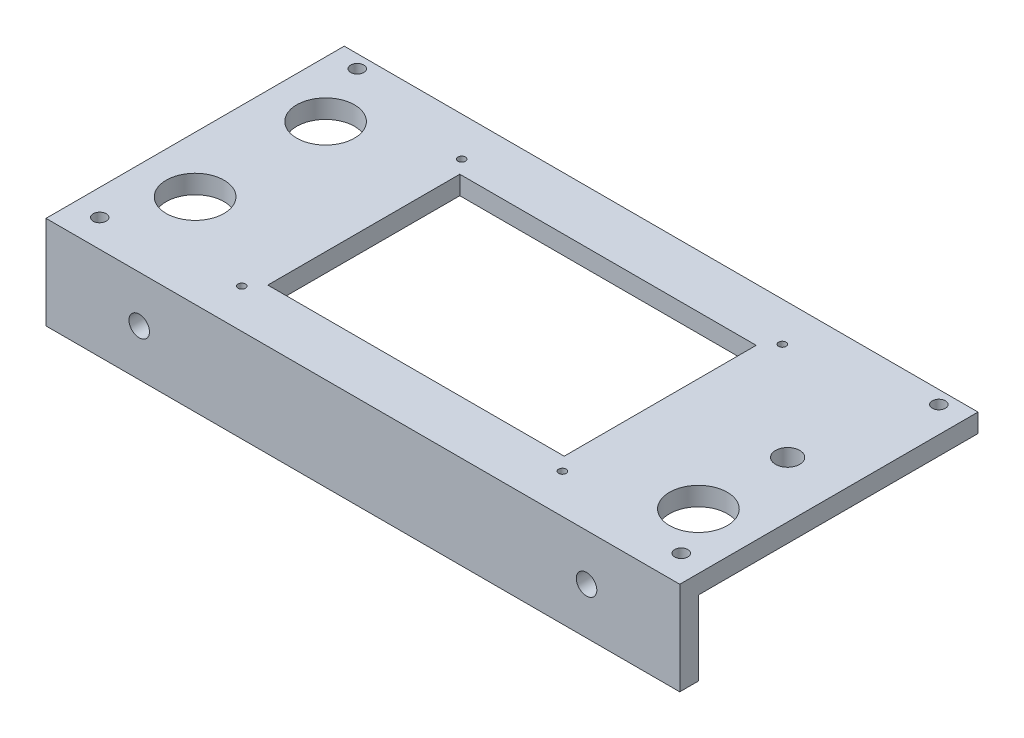
ISO-10303-21;
HEADER;
FILE_DESCRIPTION(('STEP AP214'),'2;1');
FILE_NAME('part.step','',(''),(''),'','','');
FILE_SCHEMA(('AUTOMOTIVE_DESIGN { 1 0 10303 214 1 1 1 1 }'));
ENDSEC;
DATA;
#1=APPLICATION_CONTEXT('core data for automotive mechanical design processes');
#2=APPLICATION_PROTOCOL_DEFINITION('international standard','automotive_design',2000,#1);
#3=PRODUCT_CONTEXT('',#1,'mechanical');
#4=PRODUCT('Part','Part','',(#3));
#5=PRODUCT_RELATED_PRODUCT_CATEGORY('part','',(#4));
#6=PRODUCT_DEFINITION_FORMATION('','',#4);
#7=PRODUCT_DEFINITION_CONTEXT('part definition',#1,'design');
#8=PRODUCT_DEFINITION('design','',#6,#7);
#9=PRODUCT_DEFINITION_SHAPE('','',#8);
#10=(LENGTH_UNIT() NAMED_UNIT(*) SI_UNIT(.MILLI.,.METRE.));
#11=(NAMED_UNIT(*) PLANE_ANGLE_UNIT() SI_UNIT($,.RADIAN.));
#12=(NAMED_UNIT(*) SI_UNIT($,.STERADIAN.) SOLID_ANGLE_UNIT());
#13=UNCERTAINTY_MEASURE_WITH_UNIT(LENGTH_MEASURE(1.E-05),#10,'distance_accuracy_value','');
#14=(GEOMETRIC_REPRESENTATION_CONTEXT(3) GLOBAL_UNCERTAINTY_ASSIGNED_CONTEXT((#13)) GLOBAL_UNIT_ASSIGNED_CONTEXT((#10,
#11,#12)) REPRESENTATION_CONTEXT('',''));
#15=CARTESIAN_POINT('',(0.,0.,0.));
#16=DIRECTION('',(0.,0.,1.));
#17=DIRECTION('',(1.,0.,0.));
#18=AXIS2_PLACEMENT_3D('',#15,#16,#17);
#19=CARTESIAN_POINT('',(-27.8571428571429,5.,-29.4047619047619));
#20=DIRECTION('',(1.,0.,0.));
#21=DIRECTION('',(0.,0.,-1.));
#22=AXIS2_PLACEMENT_3D('',#19,#20,#21);
#23=PLANE('',#22);
#24=DIRECTION('',(0.,0.,1.));
#25=VECTOR('',#24,1.);
#26=CARTESIAN_POINT('',(-27.8571428571429,0.,-29.4047619047619));
#27=LINE('',#26,#25);
#28=CARTESIAN_POINT('',(-27.8571428571429,0.,-29.4047619047619));
#29=VERTEX_POINT('',#28);
#30=CARTESIAN_POINT('',(-27.8571428571429,0.,45.5952380952381));
#31=VERTEX_POINT('',#30);
#32=EDGE_CURVE('E189',#29,#31,#27,.T.);
#33=ORIENTED_EDGE('',*,*,#32,.T.);
#34=DIRECTION('',(0.,1.,0.));
#35=VECTOR('',#34,1.);
#36=CARTESIAN_POINT('',(-27.8571428571429,5.,45.5952380952381));
#37=LINE('',#36,#35);
#38=CARTESIAN_POINT('',(-27.8571428571429,-20.,45.5952380952381));
#39=VERTEX_POINT('',#38);
#40=EDGE_CURVE('E130',#39,#31,#37,.T.);
#41=ORIENTED_EDGE('',*,*,#40,.F.);
#42=DIRECTION('',(0.,0.,1.));
#43=VECTOR('',#42,1.);
#44=CARTESIAN_POINT('',(-27.8571428571429,-20.,45.5952380952381));
#45=LINE('',#44,#43);
#46=CARTESIAN_POINT('',(-27.8571428571429,-20.,50.5952380952381));
#47=VERTEX_POINT('',#46);
#48=EDGE_CURVE('E128',#39,#47,#45,.T.);
#49=ORIENTED_EDGE('',*,*,#48,.T.);
#50=DIRECTION('',(0.,-1.,0.));
#51=VECTOR('',#50,1.);
#52=CARTESIAN_POINT('',(-27.8571428571429,5.,50.5952380952381));
#53=LINE('',#52,#51);
#54=CARTESIAN_POINT('',(-27.8571428571429,5.,50.5952380952381));
#55=VERTEX_POINT('',#54);
#56=EDGE_CURVE('E43',#55,#47,#53,.T.);
#57=ORIENTED_EDGE('',*,*,#56,.F.);
#58=DIRECTION('',(0.,0.,1.));
#59=VECTOR('',#58,1.);
#60=CARTESIAN_POINT('',(-27.8571428571429,5.,-29.4047619047619));
#61=LINE('',#60,#59);
#62=CARTESIAN_POINT('',(-27.8571428571429,5.,-29.4047619047619));
#63=VERTEX_POINT('',#62);
#64=EDGE_CURVE('E195',#63,#55,#61,.T.);
#65=ORIENTED_EDGE('',*,*,#64,.F.);
#66=DIRECTION('',(0.,-1.,0.));
#67=VECTOR('',#66,1.);
#68=CARTESIAN_POINT('',(-27.8571428571429,5.,-29.4047619047619));
#69=LINE('',#68,#67);
#70=EDGE_CURVE('E204',#63,#29,#69,.T.);
#71=ORIENTED_EDGE('',*,*,#70,.T.);
#72=EDGE_LOOP('',(#33,#41,#49,#57,#65,#71));
#73=FACE_BOUND('',#72,.T.);
#74=ADVANCED_FACE('F35',(#73),#23,.F.);
#75=CARTESIAN_POINT('',(-27.8571428571429,5.,50.5952380952381));
#76=DIRECTION('',(0.,0.,-1.));
#77=DIRECTION('',(-1.,0.,0.));
#78=AXIS2_PLACEMENT_3D('',#75,#76,#77);
#79=PLANE('',#78);
#80=CARTESIAN_POINT('',(-2.85714285714288,-7.5,50.5952380952381));
#81=DIRECTION('',(0.,0.,1.));
#82=DIRECTION('',(1.,0.,0.));
#83=AXIS2_PLACEMENT_3D('',#80,#81,#82);
#84=CIRCLE('',#83,2.75);
#85=CARTESIAN_POINT('',(-0.107142857142879,-7.5,50.5952380952381));
#86=VERTEX_POINT('',#85);
#87=EDGE_CURVE('E221',#86,#86,#84,.T.);
#88=ORIENTED_EDGE('',*,*,#87,.F.);
#89=EDGE_LOOP('',(#88));
#90=FACE_BOUND('',#89,.T.);
#91=CARTESIAN_POINT('',(117.142857142857,-7.5,50.5952380952381));
#92=DIRECTION('',(0.,0.,1.));
#93=DIRECTION('',(1.,0.,0.));
#94=AXIS2_PLACEMENT_3D('',#91,#92,#93);
#95=CIRCLE('',#94,2.75000000000001);
#96=CARTESIAN_POINT('',(119.892857142857,-7.5,50.5952380952381));
#97=VERTEX_POINT('',#96);
#98=EDGE_CURVE('E251',#97,#97,#95,.T.);
#99=ORIENTED_EDGE('',*,*,#98,.F.);
#100=EDGE_LOOP('',(#99));
#101=FACE_BOUND('',#100,.T.);
#102=ORIENTED_EDGE('',*,*,#56,.T.);
#103=DIRECTION('',(-1.,0.,0.));
#104=VECTOR('',#103,1.);
#105=CARTESIAN_POINT('',(142.142857142857,-20.,50.5952380952381));
#106=LINE('',#105,#104);
#107=CARTESIAN_POINT('',(142.142857142857,-20.,50.5952380952381));
#108=VERTEX_POINT('',#107);
#109=EDGE_CURVE('E120',#108,#47,#106,.T.);
#110=ORIENTED_EDGE('',*,*,#109,.F.);
#111=DIRECTION('',(0.,-1.,0.));
#112=VECTOR('',#111,1.);
#113=CARTESIAN_POINT('',(142.142857142857,5.,50.5952380952381));
#114=LINE('',#113,#112);
#115=CARTESIAN_POINT('',(142.142857142857,5.,50.5952380952381));
#116=VERTEX_POINT('',#115);
#117=EDGE_CURVE('E136',#116,#108,#114,.T.);
#118=ORIENTED_EDGE('',*,*,#117,.F.);
#119=DIRECTION('',(1.,0.,0.));
#120=VECTOR('',#119,1.);
#121=CARTESIAN_POINT('',(-27.8571428571429,5.,50.5952380952381));
#122=LINE('',#121,#120);
#123=EDGE_CURVE('E197',#55,#116,#122,.T.);
#124=ORIENTED_EDGE('',*,*,#123,.F.);
#125=EDGE_LOOP('',(#102,#110,#118,#124));
#126=FACE_BOUND('',#125,.T.);
#127=ADVANCED_FACE('F276',(#90,#101,#126),#79,.F.);
#128=CARTESIAN_POINT('',(142.142857142857,5.,-29.4047619047619));
#129=DIRECTION('',(-1.,0.,0.));
#130=DIRECTION('',(0.,0.,1.));
#131=AXIS2_PLACEMENT_3D('',#128,#129,#130);
#132=PLANE('',#131);
#133=DIRECTION('',(0.,-1.,0.));
#134=VECTOR('',#133,1.);
#135=CARTESIAN_POINT('',(142.142857142857,5.,-29.4047619047619));
#136=LINE('',#135,#134);
#137=CARTESIAN_POINT('',(142.142857142857,5.,-29.4047619047619));
#138=VERTEX_POINT('',#137);
#139=CARTESIAN_POINT('',(142.142857142857,0.,-29.4047619047619));
#140=VERTEX_POINT('',#139);
#141=EDGE_CURVE('E212',#138,#140,#136,.T.);
#142=ORIENTED_EDGE('',*,*,#141,.F.);
#143=DIRECTION('',(0.,0.,-1.));
#144=VECTOR('',#143,1.);
#145=CARTESIAN_POINT('',(142.142857142857,5.,-29.4047619047619));
#146=LINE('',#145,#144);
#147=EDGE_CURVE('E200',#116,#138,#146,.T.);
#148=ORIENTED_EDGE('',*,*,#147,.F.);
#149=ORIENTED_EDGE('',*,*,#117,.T.);
#150=DIRECTION('',(0.,0.,1.));
#151=VECTOR('',#150,1.);
#152=CARTESIAN_POINT('',(142.142857142857,-20.,45.5952380952381));
#153=LINE('',#152,#151);
#154=CARTESIAN_POINT('',(142.142857142857,-20.,45.5952380952381));
#155=VERTEX_POINT('',#154);
#156=EDGE_CURVE('E126',#155,#108,#153,.T.);
#157=ORIENTED_EDGE('',*,*,#156,.F.);
#158=DIRECTION('',(0.,-1.,0.));
#159=VECTOR('',#158,1.);
#160=CARTESIAN_POINT('',(142.142857142857,5.,45.5952380952381));
#161=LINE('',#160,#159);
#162=CARTESIAN_POINT('',(142.142857142857,0.,45.5952380952381));
#163=VERTEX_POINT('',#162);
#164=EDGE_CURVE('E112',#163,#155,#161,.T.);
#165=ORIENTED_EDGE('',*,*,#164,.F.);
#166=DIRECTION('',(0.,0.,-1.));
#167=VECTOR('',#166,1.);
#168=CARTESIAN_POINT('',(142.142857142857,0.,-29.4047619047619));
#169=LINE('',#168,#167);
#170=EDGE_CURVE('E207',#163,#140,#169,.T.);
#171=ORIENTED_EDGE('',*,*,#170,.T.);
#172=EDGE_LOOP('',(#142,#148,#149,#157,#165,#171));
#173=FACE_BOUND('',#172,.T.);
#174=ADVANCED_FACE('F133',(#173),#132,.F.);
#175=CARTESIAN_POINT('',(-27.8571428571429,5.,-29.4047619047619));
#176=DIRECTION('',(0.,0.,1.));
#177=DIRECTION('',(1.,0.,0.));
#178=AXIS2_PLACEMENT_3D('',#175,#176,#177);
#179=PLANE('',#178);
#180=DIRECTION('',(-1.,0.,0.));
#181=VECTOR('',#180,1.);
#182=CARTESIAN_POINT('',(-27.8571428571429,0.,-29.4047619047619));
#183=LINE('',#182,#181);
#184=EDGE_CURVE('E198',#140,#29,#183,.T.);
#185=ORIENTED_EDGE('',*,*,#184,.T.);
#186=ORIENTED_EDGE('',*,*,#70,.F.);
#187=DIRECTION('',(-1.,0.,0.));
#188=VECTOR('',#187,1.);
#189=CARTESIAN_POINT('',(-27.8571428571429,5.,-29.4047619047619));
#190=LINE('',#189,#188);
#191=EDGE_CURVE('E202',#138,#63,#190,.T.);
#192=ORIENTED_EDGE('',*,*,#191,.F.);
#193=ORIENTED_EDGE('',*,*,#141,.T.);
#194=EDGE_LOOP('',(#185,#186,#192,#193));
#195=FACE_BOUND('',#194,.T.);
#196=ADVANCED_FACE('F270',(#195),#179,.F.);
#197=CARTESIAN_POINT('',(0.,5.,0.));
#198=DIRECTION('',(0.,1.,0.));
#199=DIRECTION('',(0.,0.,1.));
#200=AXIS2_PLACEMENT_3D('',#197,#198,#199);
#201=PLANE('',#200);
#202=CARTESIAN_POINT('',(135.142857142857,5.,-25.9047619047619));
#203=DIRECTION('',(0.,1.,0.));
#204=DIRECTION('',(0.,0.,-1.));
#205=AXIS2_PLACEMENT_3D('',#202,#203,#204);
#206=CIRCLE('',#205,1.74999999999998);
#207=CARTESIAN_POINT('',(135.142857142857,5.,-27.6547619047619));
#208=VERTEX_POINT('',#207);
#209=EDGE_CURVE('E427',#208,#208,#206,.T.);
#210=ORIENTED_EDGE('',*,*,#209,.F.);
#211=EDGE_LOOP('',(#210));
#212=FACE_BOUND('',#211,.T.);
#213=CARTESIAN_POINT('',(135.142857142857,5.,43.1914218479792));
#214=DIRECTION('',(0.,1.,0.));
#215=DIRECTION('',(0.,0.,-1.));
#216=AXIS2_PLACEMENT_3D('',#213,#214,#215);
#217=CIRCLE('',#216,1.74999999999998);
#218=CARTESIAN_POINT('',(135.142857142857,5.,41.4414218479793));
#219=VERTEX_POINT('',#218);
#220=EDGE_CURVE('E430',#219,#219,#217,.T.);
#221=ORIENTED_EDGE('',*,*,#220,.F.);
#222=EDGE_LOOP('',(#221));
#223=FACE_BOUND('',#222,.T.);
#224=CARTESIAN_POINT('',(-20.8571428571429,5.,43.1914218479792));
#225=DIRECTION('',(0.,1.,0.));
#226=DIRECTION('',(0.,0.,1.));
#227=AXIS2_PLACEMENT_3D('',#224,#225,#226);
#228=CIRCLE('',#227,1.75);
#229=CARTESIAN_POINT('',(-20.8571428571429,5.,44.9414218479792));
#230=VERTEX_POINT('',#229);
#231=EDGE_CURVE('E373',#230,#230,#228,.T.);
#232=ORIENTED_EDGE('',*,*,#231,.F.);
#233=EDGE_LOOP('',(#232));
#234=FACE_BOUND('',#233,.T.);
#235=CARTESIAN_POINT('',(-20.8571428571429,5.,-25.9047619047619));
#236=DIRECTION('',(0.,1.,0.));
#237=DIRECTION('',(0.,0.,1.));
#238=AXIS2_PLACEMENT_3D('',#235,#236,#237);
#239=CIRCLE('',#238,1.75);
#240=CARTESIAN_POINT('',(-20.8571428571429,5.,-24.1547619047619));
#241=VERTEX_POINT('',#240);
#242=EDGE_CURVE('E228',#241,#241,#239,.T.);
#243=ORIENTED_EDGE('',*,*,#242,.F.);
#244=EDGE_LOOP('',(#243));
#245=FACE_BOUND('',#244,.T.);
#246=CARTESIAN_POINT('',(14.1428571428583,5.,40.0952380952409));
#247=DIRECTION('',(0.,-1.,0.));
#248=DIRECTION('',(0.,0.,-1.));
#249=AXIS2_PLACEMENT_3D('',#246,#247,#248);
#250=CIRCLE('',#249,0.999999999849629);
#251=CARTESIAN_POINT('',(14.1428571428583,5.,39.0952380953913));
#252=VERTEX_POINT('',#251);
#253=EDGE_CURVE('E239',#252,#252,#250,.T.);
#254=ORIENTED_EDGE('',*,*,#253,.T.);
#255=EDGE_LOOP('',(#254));
#256=FACE_BOUND('',#255,.T.);
#257=CARTESIAN_POINT('',(100.142857142858,5.,40.0952380952409));
#258=DIRECTION('',(0.,-1.,0.));
#259=DIRECTION('',(0.,0.,-1.));
#260=AXIS2_PLACEMENT_3D('',#257,#258,#259);
#261=CIRCLE('',#260,0.999999999849619);
#262=CARTESIAN_POINT('',(100.142857142858,5.,39.0952380953913));
#263=VERTEX_POINT('',#262);
#264=EDGE_CURVE('E417',#263,#263,#261,.T.);
#265=ORIENTED_EDGE('',*,*,#264,.T.);
#266=EDGE_LOOP('',(#265));
#267=FACE_BOUND('',#266,.T.);
#268=CARTESIAN_POINT('',(100.142857142858,5.,-18.9047619047591));
#269=DIRECTION('',(0.,-1.,0.));
#270=DIRECTION('',(0.,0.,-1.));
#271=AXIS2_PLACEMENT_3D('',#268,#269,#270);
#272=CIRCLE('',#271,0.999999999849635);
#273=CARTESIAN_POINT('',(100.142857142858,5.,-19.9047619046087));
#274=VERTEX_POINT('',#273);
#275=EDGE_CURVE('E255',#274,#274,#272,.T.);
#276=ORIENTED_EDGE('',*,*,#275,.T.);
#277=EDGE_LOOP('',(#276));
#278=FACE_BOUND('',#277,.T.);
#279=CARTESIAN_POINT('',(14.1428571428582,5.,-18.9047619047591));
#280=DIRECTION('',(0.,-1.,0.));
#281=DIRECTION('',(0.,0.,-1.));
#282=AXIS2_PLACEMENT_3D('',#279,#280,#281);
#283=CIRCLE('',#282,0.99999999984963);
#284=CARTESIAN_POINT('',(14.1428571428582,5.,-19.9047619046087));
#285=VERTEX_POINT('',#284);
#286=EDGE_CURVE('E248',#285,#285,#283,.T.);
#287=ORIENTED_EDGE('',*,*,#286,.T.);
#288=EDGE_LOOP('',(#287));
#289=FACE_BOUND('',#288,.T.);
#290=ORIENTED_EDGE('',*,*,#64,.T.);
#291=ORIENTED_EDGE('',*,*,#123,.T.);
#292=ORIENTED_EDGE('',*,*,#147,.T.);
#293=ORIENTED_EDGE('',*,*,#191,.T.);
#294=EDGE_LOOP('',(#290,#291,#292,#293));
#295=FACE_BOUND('',#294,.T.);
#296=CARTESIAN_POINT('',(127.142857142857,5.,30.5952380952381));
#297=DIRECTION('',(0.,1.,0.));
#298=DIRECTION('',(0.,0.,1.));
#299=AXIS2_PLACEMENT_3D('',#296,#297,#298);
#300=CIRCLE('',#299,7.75);
#301=CARTESIAN_POINT('',(127.142857142857,5.,38.3452380952381));
#302=VERTEX_POINT('',#301);
#303=EDGE_CURVE('E138',#302,#302,#300,.T.);
#304=ORIENTED_EDGE('',*,*,#303,.F.);
#305=EDGE_LOOP('',(#304));
#306=FACE_BOUND('',#305,.T.);
#307=CARTESIAN_POINT('',(-12.8571428571429,5.,25.5952380952381));
#308=DIRECTION('',(0.,1.,0.));
#309=DIRECTION('',(0.,0.,1.));
#310=AXIS2_PLACEMENT_3D('',#307,#308,#309);
#311=CIRCLE('',#310,7.75);
#312=CARTESIAN_POINT('',(-12.8571428571429,5.,33.3452380952381));
#313=VERTEX_POINT('',#312);
#314=EDGE_CURVE('E161',#313,#313,#311,.T.);
#315=ORIENTED_EDGE('',*,*,#314,.F.);
#316=EDGE_LOOP('',(#315));
#317=FACE_BOUND('',#316,.T.);
#318=CARTESIAN_POINT('',(127.142857142857,5.,6.65962369232));
#319=DIRECTION('',(0.,1.,0.));
#320=DIRECTION('',(0.,0.,1.));
#321=AXIS2_PLACEMENT_3D('',#318,#319,#320);
#322=CIRCLE('',#321,3.25000000000001);
#323=CARTESIAN_POINT('',(127.142857142857,5.,9.90962369232));
#324=VERTEX_POINT('',#323);
#325=EDGE_CURVE('E155',#324,#324,#322,.T.);
#326=ORIENTED_EDGE('',*,*,#325,.F.);
#327=EDGE_LOOP('',(#326));
#328=FACE_BOUND('',#327,.T.);
#329=CARTESIAN_POINT('',(-12.8571428571429,5.,-9.4047619047619));
#330=DIRECTION('',(0.,1.,0.));
#331=DIRECTION('',(0.,0.,1.));
#332=AXIS2_PLACEMENT_3D('',#329,#330,#331);
#333=CIRCLE('',#332,7.75);
#334=CARTESIAN_POINT('',(-12.8571428571429,5.,-1.6547619047619));
#335=VERTEX_POINT('',#334);
#336=EDGE_CURVE('E149',#335,#335,#333,.T.);
#337=ORIENTED_EDGE('',*,*,#336,.F.);
#338=EDGE_LOOP('',(#337));
#339=FACE_BOUND('',#338,.T.);
#340=DIRECTION('',(0.,0.,-1.));
#341=VECTOR('',#340,1.);
#342=CARTESIAN_POINT('',(96.8928571428572,5.,-15.1547619047619));
#343=LINE('',#342,#341);
#344=CARTESIAN_POINT('',(96.8928571428572,5.,36.3452380952381));
#345=VERTEX_POINT('',#344);
#346=CARTESIAN_POINT('',(96.8928571428572,5.,-15.1547619047619));
#347=VERTEX_POINT('',#346);
#348=EDGE_CURVE('E51',#345,#347,#343,.T.);
#349=ORIENTED_EDGE('',*,*,#348,.F.);
#350=DIRECTION('',(1.,0.,0.));
#351=VECTOR('',#350,1.);
#352=CARTESIAN_POINT('',(17.3928571428572,5.,36.3452380952381));
#353=LINE('',#352,#351);
#354=CARTESIAN_POINT('',(17.3928571428572,5.,36.3452380952381));
#355=VERTEX_POINT('',#354);
#356=EDGE_CURVE('E170',#355,#345,#353,.T.);
#357=ORIENTED_EDGE('',*,*,#356,.F.);
#358=DIRECTION('',(0.,0.,1.));
#359=VECTOR('',#358,1.);
#360=CARTESIAN_POINT('',(17.3928571428572,5.,-15.1547619047619));
#361=LINE('',#360,#359);
#362=CARTESIAN_POINT('',(17.3928571428572,5.,-15.1547619047619));
#363=VERTEX_POINT('',#362);
#364=EDGE_CURVE('E182',#363,#355,#361,.T.);
#365=ORIENTED_EDGE('',*,*,#364,.F.);
#366=DIRECTION('',(-1.,0.,0.));
#367=VECTOR('',#366,1.);
#368=CARTESIAN_POINT('',(17.3928571428572,5.,-15.1547619047619));
#369=LINE('',#368,#367);
#370=EDGE_CURVE('E179',#347,#363,#369,.T.);
#371=ORIENTED_EDGE('',*,*,#370,.F.);
#372=EDGE_LOOP('',(#349,#357,#365,#371));
#373=FACE_BOUND('',#372,.T.);
#374=ADVANCED_FACE('F273',(#212,#223,#234,#245,#256,#267,#278,#289,#295,#306,#317,#328,#339,
#373),#201,.T.);
#375=CARTESIAN_POINT('',(0.,0.,0.));
#376=DIRECTION('',(0.,1.,0.));
#377=DIRECTION('',(0.,0.,1.));
#378=AXIS2_PLACEMENT_3D('',#375,#376,#377);
#379=PLANE('',#378);
#380=CARTESIAN_POINT('',(135.142857142857,0.,-25.9047619047619));
#381=DIRECTION('',(0.,1.,0.));
#382=DIRECTION('',(0.,0.,1.));
#383=AXIS2_PLACEMENT_3D('',#380,#381,#382);
#384=CIRCLE('',#383,1.74999999999998);
#385=CARTESIAN_POINT('',(135.142857142857,0.,-24.1547619047619));
#386=VERTEX_POINT('',#385);
#387=EDGE_CURVE('E38',#386,#386,#384,.T.);
#388=ORIENTED_EDGE('',*,*,#387,.T.);
#389=EDGE_LOOP('',(#388));
#390=FACE_BOUND('',#389,.T.);
#391=CARTESIAN_POINT('',(135.142857142857,0.,43.1914218479792));
#392=DIRECTION('',(0.,1.,0.));
#393=DIRECTION('',(0.,0.,1.));
#394=AXIS2_PLACEMENT_3D('',#391,#392,#393);
#395=CIRCLE('',#394,1.74999999999998);
#396=CARTESIAN_POINT('',(135.142857142857,0.,44.9414218479792));
#397=VERTEX_POINT('',#396);
#398=EDGE_CURVE('E230',#397,#397,#395,.T.);
#399=ORIENTED_EDGE('',*,*,#398,.T.);
#400=EDGE_LOOP('',(#399));
#401=FACE_BOUND('',#400,.T.);
#402=CARTESIAN_POINT('',(-20.8571428571429,0.,43.1914218479792));
#403=DIRECTION('',(0.,1.,0.));
#404=DIRECTION('',(0.,0.,1.));
#405=AXIS2_PLACEMENT_3D('',#402,#403,#404);
#406=CIRCLE('',#405,1.75);
#407=CARTESIAN_POINT('',(-20.8571428571429,0.,44.9414218479792));
#408=VERTEX_POINT('',#407);
#409=EDGE_CURVE('E227',#408,#408,#406,.T.);
#410=ORIENTED_EDGE('',*,*,#409,.T.);
#411=EDGE_LOOP('',(#410));
#412=FACE_BOUND('',#411,.T.);
#413=CARTESIAN_POINT('',(-20.8571428571429,0.,-25.9047619047619));
#414=DIRECTION('',(0.,1.,0.));
#415=DIRECTION('',(0.,0.,1.));
#416=AXIS2_PLACEMENT_3D('',#413,#414,#415);
#417=CIRCLE('',#416,1.75);
#418=CARTESIAN_POINT('',(-20.8571428571429,0.,-24.1547619047619));
#419=VERTEX_POINT('',#418);
#420=EDGE_CURVE('E224',#419,#419,#417,.T.);
#421=ORIENTED_EDGE('',*,*,#420,.T.);
#422=EDGE_LOOP('',(#421));
#423=FACE_BOUND('',#422,.T.);
#424=CARTESIAN_POINT('',(14.1428571428583,0.,40.0952380952409));
#425=DIRECTION('',(0.,-1.,0.));
#426=DIRECTION('',(0.,0.,-1.));
#427=AXIS2_PLACEMENT_3D('',#424,#425,#426);
#428=CIRCLE('',#427,0.999999999849629);
#429=CARTESIAN_POINT('',(14.1428571428583,0.,39.0952380953913));
#430=VERTEX_POINT('',#429);
#431=EDGE_CURVE('E235',#430,#430,#428,.T.);
#432=ORIENTED_EDGE('',*,*,#431,.F.);
#433=EDGE_LOOP('',(#432));
#434=FACE_BOUND('',#433,.T.);
#435=CARTESIAN_POINT('',(100.142857142858,0.,40.0952380952409));
#436=DIRECTION('',(0.,-1.,0.));
#437=DIRECTION('',(0.,0.,-1.));
#438=AXIS2_PLACEMENT_3D('',#435,#436,#437);
#439=CIRCLE('',#438,0.999999999849619);
#440=CARTESIAN_POINT('',(100.142857142858,0.,39.0952380953913));
#441=VERTEX_POINT('',#440);
#442=EDGE_CURVE('E244',#441,#441,#439,.T.);
#443=ORIENTED_EDGE('',*,*,#442,.F.);
#444=EDGE_LOOP('',(#443));
#445=FACE_BOUND('',#444,.T.);
#446=CARTESIAN_POINT('',(100.142857142858,0.,-18.9047619047591));
#447=DIRECTION('',(0.,-1.,0.));
#448=DIRECTION('',(0.,0.,-1.));
#449=AXIS2_PLACEMENT_3D('',#446,#447,#448);
#450=CIRCLE('',#449,0.999999999849635);
#451=CARTESIAN_POINT('',(100.142857142858,0.,-19.9047619046087));
#452=VERTEX_POINT('',#451);
#453=EDGE_CURVE('E386',#452,#452,#450,.T.);
#454=ORIENTED_EDGE('',*,*,#453,.F.);
#455=EDGE_LOOP('',(#454));
#456=FACE_BOUND('',#455,.T.);
#457=CARTESIAN_POINT('',(14.1428571428582,0.,-18.9047619047591));
#458=DIRECTION('',(0.,-1.,0.));
#459=DIRECTION('',(0.,0.,-1.));
#460=AXIS2_PLACEMENT_3D('',#457,#458,#459);
#461=CIRCLE('',#460,0.99999999984963);
#462=CARTESIAN_POINT('',(14.1428571428582,0.,-19.9047619046087));
#463=VERTEX_POINT('',#462);
#464=EDGE_CURVE('E252',#463,#463,#461,.T.);
#465=ORIENTED_EDGE('',*,*,#464,.F.);
#466=EDGE_LOOP('',(#465));
#467=FACE_BOUND('',#466,.T.);
#468=CARTESIAN_POINT('',(127.142857142857,0.,30.5952380952381));
#469=DIRECTION('',(0.,1.,0.));
#470=DIRECTION('',(0.,0.,1.));
#471=AXIS2_PLACEMENT_3D('',#468,#469,#470);
#472=CIRCLE('',#471,7.75);
#473=CARTESIAN_POINT('',(127.142857142857,0.,38.3452380952381));
#474=VERTEX_POINT('',#473);
#475=EDGE_CURVE('E141',#474,#474,#472,.T.);
#476=ORIENTED_EDGE('',*,*,#475,.T.);
#477=EDGE_LOOP('',(#476));
#478=FACE_BOUND('',#477,.T.);
#479=CARTESIAN_POINT('',(-12.8571428571429,0.,25.5952380952381));
#480=DIRECTION('',(0.,1.,0.));
#481=DIRECTION('',(0.,0.,1.));
#482=AXIS2_PLACEMENT_3D('',#479,#480,#481);
#483=CIRCLE('',#482,7.75);
#484=CARTESIAN_POINT('',(-12.8571428571429,0.,33.3452380952381));
#485=VERTEX_POINT('',#484);
#486=EDGE_CURVE('E158',#485,#485,#483,.T.);
#487=ORIENTED_EDGE('',*,*,#486,.T.);
#488=EDGE_LOOP('',(#487));
#489=FACE_BOUND('',#488,.T.);
#490=CARTESIAN_POINT('',(127.142857142857,0.,6.65962369232));
#491=DIRECTION('',(0.,1.,0.));
#492=DIRECTION('',(0.,0.,1.));
#493=AXIS2_PLACEMENT_3D('',#490,#491,#492);
#494=CIRCLE('',#493,3.25000000000001);
#495=CARTESIAN_POINT('',(127.142857142857,0.,9.90962369232));
#496=VERTEX_POINT('',#495);
#497=EDGE_CURVE('E152',#496,#496,#494,.T.);
#498=ORIENTED_EDGE('',*,*,#497,.T.);
#499=EDGE_LOOP('',(#498));
#500=FACE_BOUND('',#499,.T.);
#501=CARTESIAN_POINT('',(-12.8571428571429,0.,-9.4047619047619));
#502=DIRECTION('',(0.,1.,0.));
#503=DIRECTION('',(0.,0.,1.));
#504=AXIS2_PLACEMENT_3D('',#501,#502,#503);
#505=CIRCLE('',#504,7.75);
#506=CARTESIAN_POINT('',(-12.8571428571429,0.,-1.6547619047619));
#507=VERTEX_POINT('',#506);
#508=EDGE_CURVE('E146',#507,#507,#505,.T.);
#509=ORIENTED_EDGE('',*,*,#508,.T.);
#510=EDGE_LOOP('',(#509));
#511=FACE_BOUND('',#510,.T.);
#512=DIRECTION('',(1.,0.,0.));
#513=VECTOR('',#512,1.);
#514=CARTESIAN_POINT('',(17.3928571428572,0.,36.3452380952381));
#515=LINE('',#514,#513);
#516=CARTESIAN_POINT('',(17.3928571428572,0.,36.3452380952381));
#517=VERTEX_POINT('',#516);
#518=CARTESIAN_POINT('',(96.8928571428572,0.,36.3452380952381));
#519=VERTEX_POINT('',#518);
#520=EDGE_CURVE('E174',#517,#519,#515,.T.);
#521=ORIENTED_EDGE('',*,*,#520,.T.);
#522=DIRECTION('',(0.,0.,-1.));
#523=VECTOR('',#522,1.);
#524=CARTESIAN_POINT('',(96.8928571428572,0.,-15.1547619047619));
#525=LINE('',#524,#523);
#526=CARTESIAN_POINT('',(96.8928571428572,0.,-15.1547619047619));
#527=VERTEX_POINT('',#526);
#528=EDGE_CURVE('E166',#519,#527,#525,.T.);
#529=ORIENTED_EDGE('',*,*,#528,.T.);
#530=DIRECTION('',(-1.,0.,0.));
#531=VECTOR('',#530,1.);
#532=CARTESIAN_POINT('',(17.3928571428572,0.,-15.1547619047619));
#533=LINE('',#532,#531);
#534=CARTESIAN_POINT('',(17.3928571428572,0.,-15.1547619047619));
#535=VERTEX_POINT('',#534);
#536=EDGE_CURVE('E169',#527,#535,#533,.T.);
#537=ORIENTED_EDGE('',*,*,#536,.T.);
#538=DIRECTION('',(0.,0.,1.));
#539=VECTOR('',#538,1.);
#540=CARTESIAN_POINT('',(17.3928571428572,0.,-15.1547619047619));
#541=LINE('',#540,#539);
#542=EDGE_CURVE('E59',#535,#517,#541,.T.);
#543=ORIENTED_EDGE('',*,*,#542,.T.);
#544=EDGE_LOOP('',(#521,#529,#537,#543));
#545=FACE_BOUND('',#544,.T.);
#546=ORIENTED_EDGE('',*,*,#170,.F.);
#547=DIRECTION('',(-1.,0.,0.));
#548=VECTOR('',#547,1.);
#549=CARTESIAN_POINT('',(0.,0.,45.5952380952381));
#550=LINE('',#549,#548);
#551=EDGE_CURVE('E11',#163,#31,#550,.T.);
#552=ORIENTED_EDGE('',*,*,#551,.T.);
#553=ORIENTED_EDGE('',*,*,#32,.F.);
#554=ORIENTED_EDGE('',*,*,#184,.F.);
#555=EDGE_LOOP('',(#546,#552,#553,#554));
#556=FACE_BOUND('',#555,.T.);
#557=ADVANCED_FACE('F266',(#390,#401,#412,#423,#434,#445,#456,#467,#478,#489,#500,#511,#545,
#556),#379,.F.);
#558=CARTESIAN_POINT('',(96.8928571428572,0.,-15.1547619047619));
#559=DIRECTION('',(1.,0.,0.));
#560=DIRECTION('',(0.,0.,-1.));
#561=AXIS2_PLACEMENT_3D('',#558,#559,#560);
#562=PLANE('',#561);
#563=ORIENTED_EDGE('',*,*,#348,.T.);
#564=DIRECTION('',(0.,1.,0.));
#565=VECTOR('',#564,1.);
#566=CARTESIAN_POINT('',(96.8928571428572,0.,-15.1547619047619));
#567=LINE('',#566,#565);
#568=EDGE_CURVE('E177',#527,#347,#567,.T.);
#569=ORIENTED_EDGE('',*,*,#568,.F.);
#570=ORIENTED_EDGE('',*,*,#528,.F.);
#571=DIRECTION('',(0.,1.,0.));
#572=VECTOR('',#571,1.);
#573=CARTESIAN_POINT('',(96.8928571428572,0.,36.3452380952381));
#574=LINE('',#573,#572);
#575=EDGE_CURVE('E187',#519,#345,#574,.T.);
#576=ORIENTED_EDGE('',*,*,#575,.T.);
#577=EDGE_LOOP('',(#563,#569,#570,#576));
#578=FACE_BOUND('',#577,.T.);
#579=ADVANCED_FACE('F291',(#578),#562,.F.);
#580=CARTESIAN_POINT('',(17.3928571428572,0.,36.3452380952381));
#581=DIRECTION('',(0.,0.,1.));
#582=DIRECTION('',(1.,0.,0.));
#583=AXIS2_PLACEMENT_3D('',#580,#581,#582);
#584=PLANE('',#583);
#585=ORIENTED_EDGE('',*,*,#356,.T.);
#586=ORIENTED_EDGE('',*,*,#575,.F.);
#587=ORIENTED_EDGE('',*,*,#520,.F.);
#588=DIRECTION('',(0.,1.,0.));
#589=VECTOR('',#588,1.);
#590=CARTESIAN_POINT('',(17.3928571428572,0.,36.3452380952381));
#591=LINE('',#590,#589);
#592=EDGE_CURVE('E190',#517,#355,#591,.T.);
#593=ORIENTED_EDGE('',*,*,#592,.T.);
#594=EDGE_LOOP('',(#585,#586,#587,#593));
#595=FACE_BOUND('',#594,.T.);
#596=ADVANCED_FACE('F297',(#595),#584,.F.);
#597=CARTESIAN_POINT('',(17.3928571428572,0.,-15.1547619047619));
#598=DIRECTION('',(-1.,0.,0.));
#599=DIRECTION('',(0.,0.,1.));
#600=AXIS2_PLACEMENT_3D('',#597,#598,#599);
#601=PLANE('',#600);
#602=ORIENTED_EDGE('',*,*,#364,.T.);
#603=ORIENTED_EDGE('',*,*,#592,.F.);
#604=ORIENTED_EDGE('',*,*,#542,.F.);
#605=DIRECTION('',(0.,1.,0.));
#606=VECTOR('',#605,1.);
#607=CARTESIAN_POINT('',(17.3928571428572,0.,-15.1547619047619));
#608=LINE('',#607,#606);
#609=EDGE_CURVE('E192',#535,#363,#608,.T.);
#610=ORIENTED_EDGE('',*,*,#609,.T.);
#611=EDGE_LOOP('',(#602,#603,#604,#610));
#612=FACE_BOUND('',#611,.T.);
#613=ADVANCED_FACE('F302',(#612),#601,.F.);
#614=CARTESIAN_POINT('',(17.3928571428572,0.,-15.1547619047619));
#615=DIRECTION('',(0.,0.,-1.));
#616=DIRECTION('',(-1.,0.,0.));
#617=AXIS2_PLACEMENT_3D('',#614,#615,#616);
#618=PLANE('',#617);
#619=ORIENTED_EDGE('',*,*,#370,.T.);
#620=ORIENTED_EDGE('',*,*,#609,.F.);
#621=ORIENTED_EDGE('',*,*,#536,.F.);
#622=ORIENTED_EDGE('',*,*,#568,.T.);
#623=EDGE_LOOP('',(#619,#620,#621,#622));
#624=FACE_BOUND('',#623,.T.);
#625=ADVANCED_FACE('F298',(#624),#618,.F.);
#626=CARTESIAN_POINT('',(-12.8571428571429,0.,-9.4047619047619));
#627=DIRECTION('',(0.,1.,0.));
#628=DIRECTION('',(0.,0.,1.));
#629=AXIS2_PLACEMENT_3D('',#626,#627,#628);
#630=CYLINDRICAL_SURFACE('',#629,7.75);
#631=ORIENTED_EDGE('',*,*,#508,.F.);
#632=EDGE_LOOP('',(#631));
#633=FACE_BOUND('',#632,.T.);
#634=ORIENTED_EDGE('',*,*,#336,.T.);
#635=EDGE_LOOP('',(#634));
#636=FACE_BOUND('',#635,.T.);
#637=ADVANCED_FACE('F301',(#633,#636),#630,.F.);
#638=CARTESIAN_POINT('',(127.142857142857,0.,6.65962369232));
#639=DIRECTION('',(0.,1.,0.));
#640=DIRECTION('',(0.,0.,1.));
#641=AXIS2_PLACEMENT_3D('',#638,#639,#640);
#642=CYLINDRICAL_SURFACE('',#641,3.25000000000001);
#643=ORIENTED_EDGE('',*,*,#497,.F.);
#644=EDGE_LOOP('',(#643));
#645=FACE_BOUND('',#644,.T.);
#646=ORIENTED_EDGE('',*,*,#325,.T.);
#647=EDGE_LOOP('',(#646));
#648=FACE_BOUND('',#647,.T.);
#649=ADVANCED_FACE('F316',(#645,#648),#642,.F.);
#650=CARTESIAN_POINT('',(-12.8571428571429,0.,25.5952380952381));
#651=DIRECTION('',(0.,1.,0.));
#652=DIRECTION('',(0.,0.,1.));
#653=AXIS2_PLACEMENT_3D('',#650,#651,#652);
#654=CYLINDRICAL_SURFACE('',#653,7.75);
#655=ORIENTED_EDGE('',*,*,#486,.F.);
#656=EDGE_LOOP('',(#655));
#657=FACE_BOUND('',#656,.T.);
#658=ORIENTED_EDGE('',*,*,#314,.T.);
#659=EDGE_LOOP('',(#658));
#660=FACE_BOUND('',#659,.T.);
#661=ADVANCED_FACE('F312',(#657,#660),#654,.F.);
#662=CARTESIAN_POINT('',(127.142857142857,0.,30.5952380952381));
#663=DIRECTION('',(0.,1.,0.));
#664=DIRECTION('',(0.,0.,1.));
#665=AXIS2_PLACEMENT_3D('',#662,#663,#664);
#666=CYLINDRICAL_SURFACE('',#665,7.75);
#667=ORIENTED_EDGE('',*,*,#475,.F.);
#668=EDGE_LOOP('',(#667));
#669=FACE_BOUND('',#668,.T.);
#670=ORIENTED_EDGE('',*,*,#303,.T.);
#671=EDGE_LOOP('',(#670));
#672=FACE_BOUND('',#671,.T.);
#673=ADVANCED_FACE('F309',(#669,#672),#666,.F.);
#674=CARTESIAN_POINT('',(0.,0.,45.5952380952381));
#675=DIRECTION('',(0.,0.,-1.));
#676=DIRECTION('',(-1.,0.,0.));
#677=AXIS2_PLACEMENT_3D('',#674,#675,#676);
#678=PLANE('',#677);
#679=CARTESIAN_POINT('',(-2.85714285714288,-7.5,45.5952380952381));
#680=DIRECTION('',(0.,0.,-1.));
#681=DIRECTION('',(-1.,0.,0.));
#682=AXIS2_PLACEMENT_3D('',#679,#680,#681);
#683=CIRCLE('',#682,2.75);
#684=CARTESIAN_POINT('',(-5.60714285714288,-7.5,45.5952380952381));
#685=VERTEX_POINT('',#684);
#686=EDGE_CURVE('E220',#685,#685,#683,.T.);
#687=ORIENTED_EDGE('',*,*,#686,.F.);
#688=EDGE_LOOP('',(#687));
#689=FACE_BOUND('',#688,.T.);
#690=CARTESIAN_POINT('',(117.142857142857,-7.5,45.5952380952381));
#691=DIRECTION('',(0.,0.,-1.));
#692=DIRECTION('',(-1.,0.,0.));
#693=AXIS2_PLACEMENT_3D('',#690,#691,#692);
#694=CIRCLE('',#693,2.75000000000001);
#695=CARTESIAN_POINT('',(114.392857142857,-7.5,45.5952380952381));
#696=VERTEX_POINT('',#695);
#697=EDGE_CURVE('E217',#696,#696,#694,.T.);
#698=ORIENTED_EDGE('',*,*,#697,.F.);
#699=EDGE_LOOP('',(#698));
#700=FACE_BOUND('',#699,.T.);
#701=ORIENTED_EDGE('',*,*,#551,.F.);
#702=ORIENTED_EDGE('',*,*,#164,.T.);
#703=DIRECTION('',(-1.,0.,0.));
#704=VECTOR('',#703,1.);
#705=CARTESIAN_POINT('',(142.142857142857,-20.,45.5952380952381));
#706=LINE('',#705,#704);
#707=EDGE_CURVE('E115',#155,#39,#706,.T.);
#708=ORIENTED_EDGE('',*,*,#707,.T.);
#709=ORIENTED_EDGE('',*,*,#40,.T.);
#710=EDGE_LOOP('',(#701,#702,#708,#709));
#711=FACE_BOUND('',#710,.T.);
#712=ADVANCED_FACE('F114',(#689,#700,#711),#678,.T.);
#713=CARTESIAN_POINT('',(142.142857142857,-20.,45.5952380952381));
#714=DIRECTION('',(0.,1.,0.));
#715=DIRECTION('',(0.,0.,1.));
#716=AXIS2_PLACEMENT_3D('',#713,#714,#715);
#717=PLANE('',#716);
#718=ORIENTED_EDGE('',*,*,#109,.T.);
#719=ORIENTED_EDGE('',*,*,#48,.F.);
#720=ORIENTED_EDGE('',*,*,#707,.F.);
#721=ORIENTED_EDGE('',*,*,#156,.T.);
#722=EDGE_LOOP('',(#718,#719,#720,#721));
#723=FACE_BOUND('',#722,.T.);
#724=ADVANCED_FACE('F125',(#723),#717,.F.);
#725=CARTESIAN_POINT('',(117.142857142857,-7.5,-29.4047619047619));
#726=DIRECTION('',(0.,0.,1.));
#727=DIRECTION('',(1.,0.,0.));
#728=AXIS2_PLACEMENT_3D('',#725,#726,#727);
#729=CYLINDRICAL_SURFACE('',#728,2.75000000000001);
#730=ORIENTED_EDGE('',*,*,#697,.T.);
#731=EDGE_LOOP('',(#730));
#732=FACE_BOUND('',#731,.T.);
#733=ORIENTED_EDGE('',*,*,#98,.T.);
#734=EDGE_LOOP('',(#733));
#735=FACE_BOUND('',#734,.T.);
#736=ADVANCED_FACE('F326',(#732,#735),#729,.F.);
#737=CARTESIAN_POINT('',(-2.85714285714288,-7.5,-29.4047619047619));
#738=DIRECTION('',(0.,0.,1.));
#739=DIRECTION('',(1.,0.,0.));
#740=AXIS2_PLACEMENT_3D('',#737,#738,#739);
#741=CYLINDRICAL_SURFACE('',#740,2.75);
#742=ORIENTED_EDGE('',*,*,#686,.T.);
#743=EDGE_LOOP('',(#742));
#744=FACE_BOUND('',#743,.T.);
#745=ORIENTED_EDGE('',*,*,#87,.T.);
#746=EDGE_LOOP('',(#745));
#747=FACE_BOUND('',#746,.T.);
#748=ADVANCED_FACE('F332',(#744,#747),#741,.F.);
#749=CARTESIAN_POINT('',(14.1428571428582,5.,-18.9047619047591));
#750=DIRECTION('',(0.,-1.,0.));
#751=DIRECTION('',(0.,0.,-1.));
#752=AXIS2_PLACEMENT_3D('',#749,#750,#751);
#753=CYLINDRICAL_SURFACE('',#752,0.99999999984963);
#754=ORIENTED_EDGE('',*,*,#286,.F.);
#755=EDGE_LOOP('',(#754));
#756=FACE_BOUND('',#755,.T.);
#757=ORIENTED_EDGE('',*,*,#464,.T.);
#758=EDGE_LOOP('',(#757));
#759=FACE_BOUND('',#758,.T.);
#760=ADVANCED_FACE('F336',(#756,#759),#753,.F.);
#761=CARTESIAN_POINT('',(100.142857142858,5.,-18.9047619047591));
#762=DIRECTION('',(0.,-1.,0.));
#763=DIRECTION('',(0.,0.,-1.));
#764=AXIS2_PLACEMENT_3D('',#761,#762,#763);
#765=CYLINDRICAL_SURFACE('',#764,0.999999999849635);
#766=ORIENTED_EDGE('',*,*,#275,.F.);
#767=EDGE_LOOP('',(#766));
#768=FACE_BOUND('',#767,.T.);
#769=ORIENTED_EDGE('',*,*,#453,.T.);
#770=EDGE_LOOP('',(#769));
#771=FACE_BOUND('',#770,.T.);
#772=ADVANCED_FACE('F340',(#768,#771),#765,.F.);
#773=CARTESIAN_POINT('',(100.142857142858,5.,40.0952380952409));
#774=DIRECTION('',(0.,-1.,0.));
#775=DIRECTION('',(0.,0.,-1.));
#776=AXIS2_PLACEMENT_3D('',#773,#774,#775);
#777=CYLINDRICAL_SURFACE('',#776,0.999999999849619);
#778=ORIENTED_EDGE('',*,*,#264,.F.);
#779=EDGE_LOOP('',(#778));
#780=FACE_BOUND('',#779,.T.);
#781=ORIENTED_EDGE('',*,*,#442,.T.);
#782=EDGE_LOOP('',(#781));
#783=FACE_BOUND('',#782,.T.);
#784=ADVANCED_FACE('F346',(#780,#783),#777,.F.);
#785=CARTESIAN_POINT('',(14.1428571428583,5.,40.0952380952409));
#786=DIRECTION('',(0.,-1.,0.));
#787=DIRECTION('',(0.,0.,-1.));
#788=AXIS2_PLACEMENT_3D('',#785,#786,#787);
#789=CYLINDRICAL_SURFACE('',#788,0.999999999849629);
#790=ORIENTED_EDGE('',*,*,#253,.F.);
#791=EDGE_LOOP('',(#790));
#792=FACE_BOUND('',#791,.T.);
#793=ORIENTED_EDGE('',*,*,#431,.T.);
#794=EDGE_LOOP('',(#793));
#795=FACE_BOUND('',#794,.T.);
#796=ADVANCED_FACE('F342',(#792,#795),#789,.F.);
#797=CARTESIAN_POINT('',(-20.8571428571429,-20.,-25.9047619047619));
#798=DIRECTION('',(0.,1.,0.));
#799=DIRECTION('',(0.,0.,1.));
#800=AXIS2_PLACEMENT_3D('',#797,#798,#799);
#801=CYLINDRICAL_SURFACE('',#800,1.75);
#802=ORIENTED_EDGE('',*,*,#242,.T.);
#803=EDGE_LOOP('',(#802));
#804=FACE_BOUND('',#803,.T.);
#805=ORIENTED_EDGE('',*,*,#420,.F.);
#806=EDGE_LOOP('',(#805));
#807=FACE_BOUND('',#806,.T.);
#808=ADVANCED_FACE('F345',(#804,#807),#801,.F.);
#809=CARTESIAN_POINT('',(-20.8571428571429,-20.,43.1914218479792));
#810=DIRECTION('',(0.,1.,0.));
#811=DIRECTION('',(0.,0.,1.));
#812=AXIS2_PLACEMENT_3D('',#809,#810,#811);
#813=CYLINDRICAL_SURFACE('',#812,1.75);
#814=ORIENTED_EDGE('',*,*,#231,.T.);
#815=EDGE_LOOP('',(#814));
#816=FACE_BOUND('',#815,.T.);
#817=ORIENTED_EDGE('',*,*,#409,.F.);
#818=EDGE_LOOP('',(#817));
#819=FACE_BOUND('',#818,.T.);
#820=ADVANCED_FACE('F356',(#816,#819),#813,.F.);
#821=CARTESIAN_POINT('',(135.142857142857,-20.,43.1914218479792));
#822=DIRECTION('',(0.,1.,0.));
#823=DIRECTION('',(0.,0.,1.));
#824=AXIS2_PLACEMENT_3D('',#821,#822,#823);
#825=CYLINDRICAL_SURFACE('',#824,1.74999999999998);
#826=ORIENTED_EDGE('',*,*,#220,.T.);
#827=EDGE_LOOP('',(#826));
#828=FACE_BOUND('',#827,.T.);
#829=ORIENTED_EDGE('',*,*,#398,.F.);
#830=EDGE_LOOP('',(#829));
#831=FACE_BOUND('',#830,.T.);
#832=ADVANCED_FACE('F361',(#828,#831),#825,.F.);
#833=CARTESIAN_POINT('',(135.142857142857,-20.,-25.9047619047619));
#834=DIRECTION('',(0.,1.,0.));
#835=DIRECTION('',(0.,0.,1.));
#836=AXIS2_PLACEMENT_3D('',#833,#834,#835);
#837=CYLINDRICAL_SURFACE('',#836,1.74999999999998);
#838=ORIENTED_EDGE('',*,*,#209,.T.);
#839=EDGE_LOOP('',(#838));
#840=FACE_BOUND('',#839,.T.);
#841=ORIENTED_EDGE('',*,*,#387,.F.);
#842=EDGE_LOOP('',(#841));
#843=FACE_BOUND('',#842,.T.);
#844=ADVANCED_FACE('F358',(#840,#843),#837,.F.);
#845=CLOSED_SHELL('',(#74,#127,#174,#196,#374,#557,#579,#596,#613,#625,#637,#649,#661,#673,#712,
#724,#736,#748,#760,#772,#784,#796,#808,#820,#832,#844));
#846=MANIFOLD_SOLID_BREP('B2',#845);
#847=ADVANCED_BREP_SHAPE_REPRESENTATION('',(#18,#846),#14);
#848=SHAPE_DEFINITION_REPRESENTATION(#9,#847);
ENDSEC;
END-ISO-10303-21;
